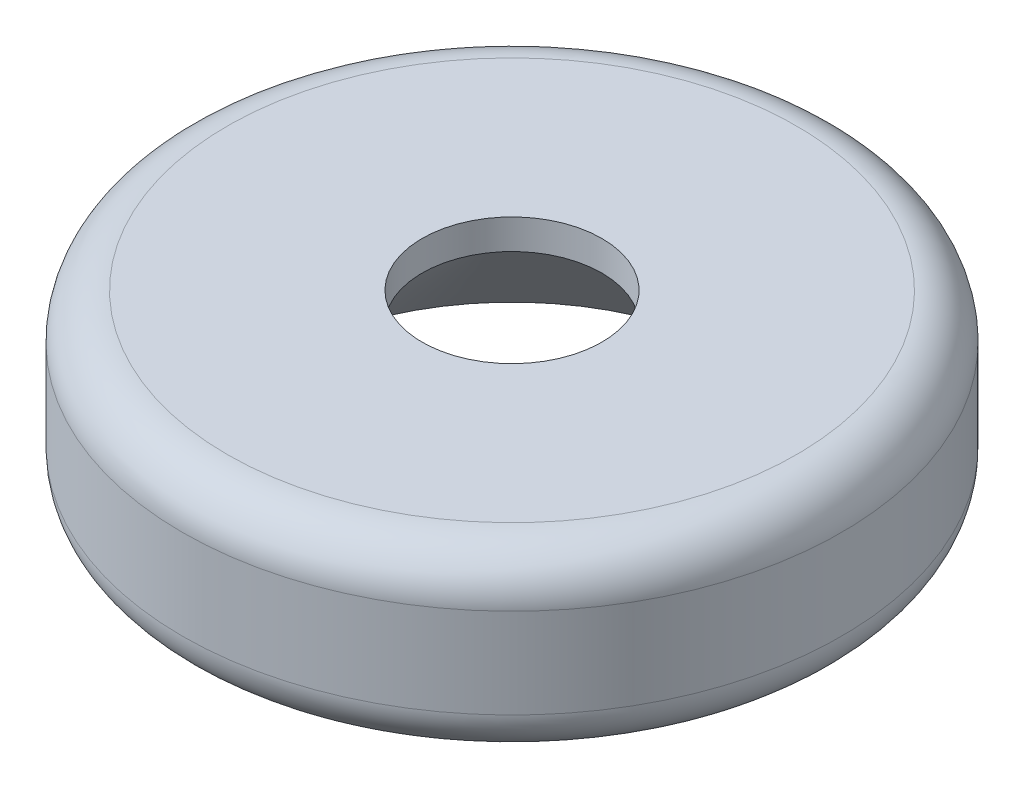
ISO-10303-21;
HEADER;
FILE_DESCRIPTION(('STEP AP214'),'2;1');
FILE_NAME('part.step','',(''),(''),'','','');
FILE_SCHEMA(('AUTOMOTIVE_DESIGN { 1 0 10303 214 1 1 1 1 }'));
ENDSEC;
DATA;
#1=APPLICATION_CONTEXT('core data for automotive mechanical design processes');
#2=APPLICATION_PROTOCOL_DEFINITION('international standard','automotive_design',2000,#1);
#3=PRODUCT_CONTEXT('',#1,'mechanical');
#4=PRODUCT('Part','Part','',(#3));
#5=PRODUCT_RELATED_PRODUCT_CATEGORY('part','',(#4));
#6=PRODUCT_DEFINITION_FORMATION('','',#4);
#7=PRODUCT_DEFINITION_CONTEXT('part definition',#1,'design');
#8=PRODUCT_DEFINITION('design','',#6,#7);
#9=PRODUCT_DEFINITION_SHAPE('','',#8);
#10=(LENGTH_UNIT() NAMED_UNIT(*) SI_UNIT(.MILLI.,.METRE.));
#11=(NAMED_UNIT(*) PLANE_ANGLE_UNIT() SI_UNIT($,.RADIAN.));
#12=(NAMED_UNIT(*) SI_UNIT($,.STERADIAN.) SOLID_ANGLE_UNIT());
#13=UNCERTAINTY_MEASURE_WITH_UNIT(LENGTH_MEASURE(1.E-05),#10,'distance_accuracy_value','');
#14=(GEOMETRIC_REPRESENTATION_CONTEXT(3) GLOBAL_UNCERTAINTY_ASSIGNED_CONTEXT((#13)) GLOBAL_UNIT_ASSIGNED_CONTEXT((#10,
#11,#12)) REPRESENTATION_CONTEXT('',''));
#15=CARTESIAN_POINT('',(0.,0.,0.));
#16=DIRECTION('',(0.,0.,1.));
#17=DIRECTION('',(1.,0.,0.));
#18=AXIS2_PLACEMENT_3D('',#15,#16,#17);
#19=CARTESIAN_POINT('',(0.,6.,0.));
#20=DIRECTION('',(0.,-1.,0.));
#21=DIRECTION('',(0.,0.,-1.));
#22=AXIS2_PLACEMENT_3D('',#19,#20,#21);
#23=CYLINDRICAL_SURFACE('',#22,11.);
#24=CARTESIAN_POINT('',(0.,4.5,0.));
#25=DIRECTION('',(0.,1.,0.));
#26=DIRECTION('',(0.,0.,1.));
#27=AXIS2_PLACEMENT_3D('',#24,#25,#26);
#28=CIRCLE('',#27,11.);
#29=CARTESIAN_POINT('',(0.,4.5,11.));
#30=VERTEX_POINT('',#29);
#31=EDGE_CURVE('E10',#30,#30,#28,.F.);
#32=ORIENTED_EDGE('',*,*,#31,.T.);
#33=EDGE_LOOP('',(#32));
#34=FACE_BOUND('',#33,.T.);
#35=CARTESIAN_POINT('',(0.,1.5,0.));
#36=DIRECTION('',(0.,1.,0.));
#37=DIRECTION('',(0.,0.,1.));
#38=AXIS2_PLACEMENT_3D('',#35,#36,#37);
#39=CIRCLE('',#38,11.);
#40=CARTESIAN_POINT('',(0.,1.5,11.));
#41=VERTEX_POINT('',#40);
#42=EDGE_CURVE('E49',#41,#41,#39,.T.);
#43=ORIENTED_EDGE('',*,*,#42,.T.);
#44=EDGE_LOOP('',(#43));
#45=FACE_BOUND('',#44,.T.);
#46=ADVANCED_FACE('F34',(#34,#45),#23,.T.);
#47=CARTESIAN_POINT('',(0.,6.,0.));
#48=DIRECTION('',(0.,1.,0.));
#49=DIRECTION('',(0.,0.,1.));
#50=AXIS2_PLACEMENT_3D('',#47,#48,#49);
#51=PLANE('',#50);
#52=CARTESIAN_POINT('',(0.,6.,0.));
#53=DIRECTION('',(0.,1.,0.));
#54=DIRECTION('',(0.,0.,1.));
#55=AXIS2_PLACEMENT_3D('',#52,#53,#54);
#56=CIRCLE('',#55,9.5);
#57=CARTESIAN_POINT('',(0.,6.,9.5));
#58=VERTEX_POINT('',#57);
#59=EDGE_CURVE('E41',#58,#58,#56,.T.);
#60=ORIENTED_EDGE('',*,*,#59,.T.);
#61=EDGE_LOOP('',(#60));
#62=FACE_BOUND('',#61,.T.);
#63=CARTESIAN_POINT('',(0.,6.,0.));
#64=DIRECTION('',(0.,-1.,0.));
#65=DIRECTION('',(0.,0.,-1.));
#66=AXIS2_PLACEMENT_3D('',#63,#64,#65);
#67=CIRCLE('',#66,3.);
#68=CARTESIAN_POINT('',(0.,6.,-3.));
#69=VERTEX_POINT('',#68);
#70=EDGE_CURVE('E57',#69,#69,#67,.T.);
#71=ORIENTED_EDGE('',*,*,#70,.T.);
#72=EDGE_LOOP('',(#71));
#73=FACE_BOUND('',#72,.T.);
#74=ADVANCED_FACE('F64',(#62,#73),#51,.T.);
#75=CARTESIAN_POINT('',(0.,0.,0.));
#76=DIRECTION('',(0.,1.,0.));
#77=DIRECTION('',(0.,0.,1.));
#78=AXIS2_PLACEMENT_3D('',#75,#76,#77);
#79=PLANE('',#78);
#80=CARTESIAN_POINT('',(0.,0.,0.));
#81=DIRECTION('',(0.,1.,0.));
#82=DIRECTION('',(0.,0.,1.));
#83=AXIS2_PLACEMENT_3D('',#80,#81,#82);
#84=CIRCLE('',#83,9.5);
#85=CARTESIAN_POINT('',(0.,0.,9.5));
#86=VERTEX_POINT('',#85);
#87=EDGE_CURVE('E45',#86,#86,#84,.F.);
#88=ORIENTED_EDGE('',*,*,#87,.T.);
#89=EDGE_LOOP('',(#88));
#90=FACE_BOUND('',#89,.T.);
#91=CARTESIAN_POINT('',(0.,0.,0.));
#92=DIRECTION('',(0.,-1.,0.));
#93=DIRECTION('',(0.,0.,-1.));
#94=AXIS2_PLACEMENT_3D('',#91,#92,#93);
#95=CIRCLE('',#94,8.);
#96=CARTESIAN_POINT('',(0.,0.,-8.));
#97=VERTEX_POINT('',#96);
#98=EDGE_CURVE('E54',#97,#97,#95,.T.);
#99=ORIENTED_EDGE('',*,*,#98,.F.);
#100=EDGE_LOOP('',(#99));
#101=FACE_BOUND('',#100,.T.);
#102=ADVANCED_FACE('F76',(#90,#101),#79,.F.);
#103=CARTESIAN_POINT('',(0.,0.,0.));
#104=DIRECTION('',(0.,-1.,0.));
#105=DIRECTION('',(0.,0.,-1.));
#106=AXIS2_PLACEMENT_3D('',#103,#104,#105);
#107=CONICAL_SURFACE('',#106,8.,0.78539816339745);
#108=CARTESIAN_POINT('',(0.,5.,0.));
#109=DIRECTION('',(0.,-1.,0.));
#110=DIRECTION('',(0.,0.,-1.));
#111=AXIS2_PLACEMENT_3D('',#108,#109,#110);
#112=CIRCLE('',#111,3.);
#113=CARTESIAN_POINT('',(0.,5.,-3.));
#114=VERTEX_POINT('',#113);
#115=EDGE_CURVE('E58',#114,#114,#112,.T.);
#116=ORIENTED_EDGE('',*,*,#115,.F.);
#117=EDGE_LOOP('',(#116));
#118=FACE_BOUND('',#117,.T.);
#119=ORIENTED_EDGE('',*,*,#98,.T.);
#120=EDGE_LOOP('',(#119));
#121=FACE_BOUND('',#120,.T.);
#122=ADVANCED_FACE('F70',(#118,#121),#107,.F.);
#123=CARTESIAN_POINT('',(0.,6.,0.));
#124=DIRECTION('',(0.,-1.,0.));
#125=DIRECTION('',(0.,0.,-1.));
#126=AXIS2_PLACEMENT_3D('',#123,#124,#125);
#127=CYLINDRICAL_SURFACE('',#126,3.);
#128=ORIENTED_EDGE('',*,*,#70,.F.);
#129=EDGE_LOOP('',(#128));
#130=FACE_BOUND('',#129,.T.);
#131=ORIENTED_EDGE('',*,*,#115,.T.);
#132=EDGE_LOOP('',(#131));
#133=FACE_BOUND('',#132,.T.);
#134=ADVANCED_FACE('F66',(#130,#133),#127,.F.);
#135=CARTESIAN_POINT('',(0.,1.5,0.));
#136=DIRECTION('',(0.,1.,0.));
#137=DIRECTION('',(0.,0.,1.));
#138=AXIS2_PLACEMENT_3D('',#135,#136,#137);
#139=TOROIDAL_SURFACE('',#138,9.5,1.5);
#140=ORIENTED_EDGE('',*,*,#87,.F.);
#141=EDGE_LOOP('',(#140));
#142=FACE_BOUND('',#141,.T.);
#143=ORIENTED_EDGE('',*,*,#42,.F.);
#144=EDGE_LOOP('',(#143));
#145=FACE_BOUND('',#144,.T.);
#146=ADVANCED_FACE('F69',(#142,#145),#139,.T.);
#147=CARTESIAN_POINT('',(0.,4.5,0.));
#148=DIRECTION('',(0.,1.,0.));
#149=DIRECTION('',(0.,0.,1.));
#150=AXIS2_PLACEMENT_3D('',#147,#148,#149);
#151=TOROIDAL_SURFACE('',#150,9.5,1.5);
#152=ORIENTED_EDGE('',*,*,#31,.F.);
#153=EDGE_LOOP('',(#152));
#154=FACE_BOUND('',#153,.T.);
#155=ORIENTED_EDGE('',*,*,#59,.F.);
#156=EDGE_LOOP('',(#155));
#157=FACE_BOUND('',#156,.T.);
#158=ADVANCED_FACE('F36',(#154,#157),#151,.T.);
#159=CLOSED_SHELL('',(#46,#74,#102,#122,#134,#146,#158));
#160=MANIFOLD_SOLID_BREP('B2',#159);
#161=ADVANCED_BREP_SHAPE_REPRESENTATION('',(#18,#160),#14);
#162=SHAPE_DEFINITION_REPRESENTATION(#9,#161);
ENDSEC;
END-ISO-10303-21;
